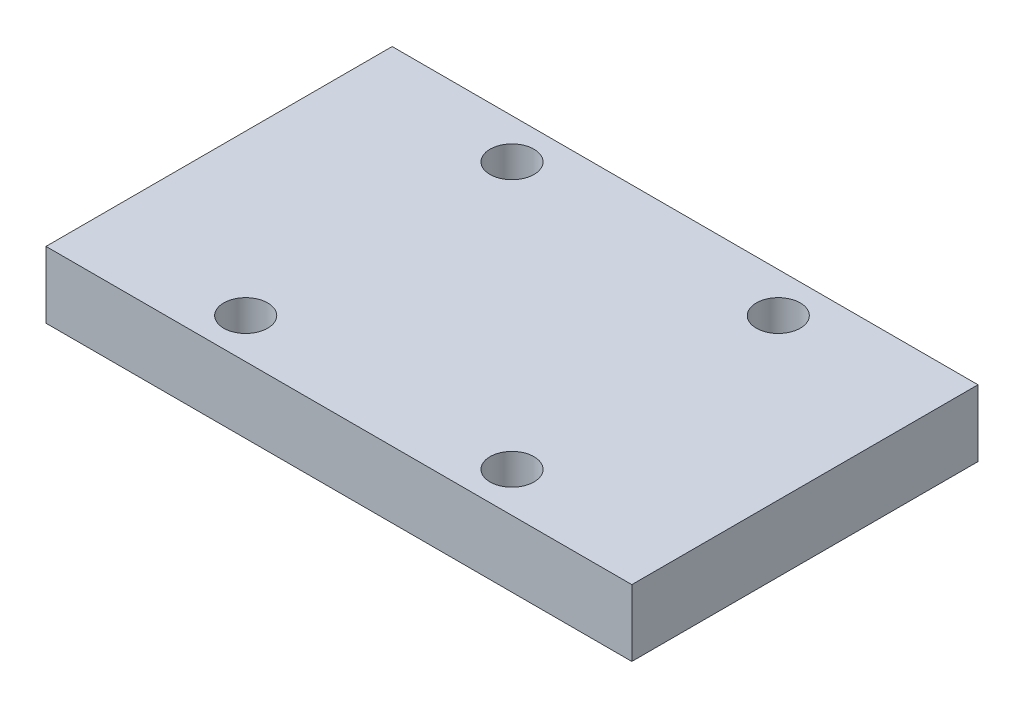
ISO-10303-21;
HEADER;
FILE_DESCRIPTION(('STEP AP214'),'2;1');
FILE_NAME('part.step','',(''),(''),'','','');
FILE_SCHEMA(('AUTOMOTIVE_DESIGN { 1 0 10303 214 1 1 1 1 }'));
ENDSEC;
DATA;
#1=APPLICATION_CONTEXT('core data for automotive mechanical design processes');
#2=APPLICATION_PROTOCOL_DEFINITION('international standard','automotive_design',2000,#1);
#3=PRODUCT_CONTEXT('',#1,'mechanical');
#4=PRODUCT('Part','Part','',(#3));
#5=PRODUCT_RELATED_PRODUCT_CATEGORY('part','',(#4));
#6=PRODUCT_DEFINITION_FORMATION('','',#4);
#7=PRODUCT_DEFINITION_CONTEXT('part definition',#1,'design');
#8=PRODUCT_DEFINITION('design','',#6,#7);
#9=PRODUCT_DEFINITION_SHAPE('','',#8);
#10=(LENGTH_UNIT() NAMED_UNIT(*) SI_UNIT(.MILLI.,.METRE.));
#11=(NAMED_UNIT(*) PLANE_ANGLE_UNIT() SI_UNIT($,.RADIAN.));
#12=(NAMED_UNIT(*) SI_UNIT($,.STERADIAN.) SOLID_ANGLE_UNIT());
#13=UNCERTAINTY_MEASURE_WITH_UNIT(LENGTH_MEASURE(1.E-05),#10,'distance_accuracy_value','');
#14=(GEOMETRIC_REPRESENTATION_CONTEXT(3) GLOBAL_UNCERTAINTY_ASSIGNED_CONTEXT((#13)) GLOBAL_UNIT_ASSIGNED_CONTEXT((#10,
#11,#12)) REPRESENTATION_CONTEXT('',''));
#15=CARTESIAN_POINT('',(0.,0.,0.));
#16=DIRECTION('',(0.,0.,1.));
#17=DIRECTION('',(1.,0.,0.));
#18=AXIS2_PLACEMENT_3D('',#15,#16,#17);
#19=CARTESIAN_POINT('',(-22.,-5.,0.));
#20=DIRECTION('',(-1.,0.,0.));
#21=DIRECTION('',(0.,0.,1.));
#22=AXIS2_PLACEMENT_3D('',#19,#20,#21);
#23=PLANE('',#22);
#24=DIRECTION('',(0.,0.,1.));
#25=VECTOR('',#24,1.);
#26=CARTESIAN_POINT('',(-22.,0.,0.));
#27=LINE('',#26,#25);
#28=CARTESIAN_POINT('',(-22.,0.,-13.));
#29=VERTEX_POINT('',#28);
#30=CARTESIAN_POINT('',(-22.,0.,13.));
#31=VERTEX_POINT('',#30);
#32=EDGE_CURVE('E116',#29,#31,#27,.T.);
#33=ORIENTED_EDGE('',*,*,#32,.F.);
#34=DIRECTION('',(0.,1.,0.));
#35=VECTOR('',#34,1.);
#36=CARTESIAN_POINT('',(-22.,-5.,-13.));
#37=LINE('',#36,#35);
#38=CARTESIAN_POINT('',(-22.,-5.,-13.));
#39=VERTEX_POINT('',#38);
#40=EDGE_CURVE('E11',#39,#29,#37,.T.);
#41=ORIENTED_EDGE('',*,*,#40,.F.);
#42=DIRECTION('',(0.,0.,1.));
#43=VECTOR('',#42,1.);
#44=CARTESIAN_POINT('',(-22.,-5.,0.));
#45=LINE('',#44,#43);
#46=CARTESIAN_POINT('',(-22.,-5.,13.));
#47=VERTEX_POINT('',#46);
#48=EDGE_CURVE('E98',#39,#47,#45,.T.);
#49=ORIENTED_EDGE('',*,*,#48,.T.);
#50=DIRECTION('',(0.,1.,0.));
#51=VECTOR('',#50,1.);
#52=CARTESIAN_POINT('',(-22.,-5.,13.));
#53=LINE('',#52,#51);
#54=EDGE_CURVE('E40',#47,#31,#53,.T.);
#55=ORIENTED_EDGE('',*,*,#54,.T.);
#56=EDGE_LOOP('',(#33,#41,#49,#55));
#57=FACE_BOUND('',#56,.T.);
#58=ADVANCED_FACE('F37',(#57),#23,.T.);
#59=CARTESIAN_POINT('',(0.,-5.,-13.));
#60=DIRECTION('',(0.,0.,1.));
#61=DIRECTION('',(1.,0.,0.));
#62=AXIS2_PLACEMENT_3D('',#59,#60,#61);
#63=PLANE('',#62);
#64=DIRECTION('',(1.,0.,0.));
#65=VECTOR('',#64,1.);
#66=CARTESIAN_POINT('',(0.,0.,-13.));
#67=LINE('',#66,#65);
#68=CARTESIAN_POINT('',(22.,0.,-13.));
#69=VERTEX_POINT('',#68);
#70=EDGE_CURVE('E70',#29,#69,#67,.T.);
#71=ORIENTED_EDGE('',*,*,#70,.T.);
#72=DIRECTION('',(0.,1.,0.));
#73=VECTOR('',#72,1.);
#74=CARTESIAN_POINT('',(22.,-5.,-13.));
#75=LINE('',#74,#73);
#76=CARTESIAN_POINT('',(22.,-5.,-13.));
#77=VERTEX_POINT('',#76);
#78=EDGE_CURVE('E46',#77,#69,#75,.T.);
#79=ORIENTED_EDGE('',*,*,#78,.F.);
#80=DIRECTION('',(1.,0.,0.));
#81=VECTOR('',#80,1.);
#82=CARTESIAN_POINT('',(0.,-5.,-13.));
#83=LINE('',#82,#81);
#84=EDGE_CURVE('E88',#39,#77,#83,.T.);
#85=ORIENTED_EDGE('',*,*,#84,.F.);
#86=ORIENTED_EDGE('',*,*,#40,.T.);
#87=EDGE_LOOP('',(#71,#79,#85,#86));
#88=FACE_BOUND('',#87,.T.);
#89=ADVANCED_FACE('F138',(#88),#63,.F.);
#90=CARTESIAN_POINT('',(22.,-5.,0.));
#91=DIRECTION('',(-1.,0.,0.));
#92=DIRECTION('',(0.,0.,1.));
#93=AXIS2_PLACEMENT_3D('',#90,#91,#92);
#94=PLANE('',#93);
#95=DIRECTION('',(0.,0.,1.));
#96=VECTOR('',#95,1.);
#97=CARTESIAN_POINT('',(22.,0.,0.));
#98=LINE('',#97,#96);
#99=CARTESIAN_POINT('',(22.,0.,13.));
#100=VERTEX_POINT('',#99);
#101=EDGE_CURVE('E95',#69,#100,#98,.T.);
#102=ORIENTED_EDGE('',*,*,#101,.T.);
#103=DIRECTION('',(0.,1.,0.));
#104=VECTOR('',#103,1.);
#105=CARTESIAN_POINT('',(22.,-5.,13.));
#106=LINE('',#105,#104);
#107=CARTESIAN_POINT('',(22.,-5.,13.));
#108=VERTEX_POINT('',#107);
#109=EDGE_CURVE('E92',#108,#100,#106,.T.);
#110=ORIENTED_EDGE('',*,*,#109,.F.);
#111=DIRECTION('',(0.,0.,1.));
#112=VECTOR('',#111,1.);
#113=CARTESIAN_POINT('',(22.,-5.,0.));
#114=LINE('',#113,#112);
#115=EDGE_CURVE('E82',#77,#108,#114,.T.);
#116=ORIENTED_EDGE('',*,*,#115,.F.);
#117=ORIENTED_EDGE('',*,*,#78,.T.);
#118=EDGE_LOOP('',(#102,#110,#116,#117));
#119=FACE_BOUND('',#118,.T.);
#120=ADVANCED_FACE('F93',(#119),#94,.F.);
#121=CARTESIAN_POINT('',(10.,-5.,10.));
#122=DIRECTION('',(0.,1.,0.));
#123=DIRECTION('',(0.,0.,1.));
#124=AXIS2_PLACEMENT_3D('',#121,#122,#123);
#125=CYLINDRICAL_SURFACE('',#124,1.65);
#126=CARTESIAN_POINT('',(10.,-5.,10.));
#127=DIRECTION('',(0.,1.,0.));
#128=DIRECTION('',(0.,0.,1.));
#129=AXIS2_PLACEMENT_3D('',#126,#127,#128);
#130=CIRCLE('',#129,1.65);
#131=CARTESIAN_POINT('',(10.,-5.,11.65));
#132=VERTEX_POINT('',#131);
#133=EDGE_CURVE('E110',#132,#132,#130,.T.);
#134=ORIENTED_EDGE('',*,*,#133,.F.);
#135=EDGE_LOOP('',(#134));
#136=FACE_BOUND('',#135,.T.);
#137=CARTESIAN_POINT('',(10.,0.,10.));
#138=DIRECTION('',(0.,1.,0.));
#139=DIRECTION('',(0.,0.,1.));
#140=AXIS2_PLACEMENT_3D('',#137,#138,#139);
#141=CIRCLE('',#140,1.65);
#142=CARTESIAN_POINT('',(10.,0.,11.65));
#143=VERTEX_POINT('',#142);
#144=EDGE_CURVE('E129',#143,#143,#141,.T.);
#145=ORIENTED_EDGE('',*,*,#144,.T.);
#146=EDGE_LOOP('',(#145));
#147=FACE_BOUND('',#146,.T.);
#148=ADVANCED_FACE('F146',(#136,#147),#125,.F.);
#149=CARTESIAN_POINT('',(10.,-5.,-10.));
#150=DIRECTION('',(0.,1.,0.));
#151=DIRECTION('',(0.,0.,1.));
#152=AXIS2_PLACEMENT_3D('',#149,#150,#151);
#153=CYLINDRICAL_SURFACE('',#152,1.65);
#154=CARTESIAN_POINT('',(10.,-5.,-10.));
#155=DIRECTION('',(0.,1.,0.));
#156=DIRECTION('',(0.,0.,1.));
#157=AXIS2_PLACEMENT_3D('',#154,#155,#156);
#158=CIRCLE('',#157,1.65);
#159=CARTESIAN_POINT('',(10.,-5.,-8.35));
#160=VERTEX_POINT('',#159);
#161=EDGE_CURVE('E107',#160,#160,#158,.F.);
#162=ORIENTED_EDGE('',*,*,#161,.T.);
#163=EDGE_LOOP('',(#162));
#164=FACE_BOUND('',#163,.T.);
#165=CARTESIAN_POINT('',(10.,0.,-10.));
#166=DIRECTION('',(0.,1.,0.));
#167=DIRECTION('',(0.,0.,1.));
#168=AXIS2_PLACEMENT_3D('',#165,#166,#167);
#169=CIRCLE('',#168,1.65);
#170=CARTESIAN_POINT('',(10.,0.,-8.35));
#171=VERTEX_POINT('',#170);
#172=EDGE_CURVE('E126',#171,#171,#169,.F.);
#173=ORIENTED_EDGE('',*,*,#172,.F.);
#174=EDGE_LOOP('',(#173));
#175=FACE_BOUND('',#174,.T.);
#176=ADVANCED_FACE('F159',(#164,#175),#153,.F.);
#177=CARTESIAN_POINT('',(-10.,-5.,-9.99999999999999));
#178=DIRECTION('',(0.,1.,0.));
#179=DIRECTION('',(0.,0.,1.));
#180=AXIS2_PLACEMENT_3D('',#177,#178,#179);
#181=CYLINDRICAL_SURFACE('',#180,1.65);
#182=CARTESIAN_POINT('',(-10.,-5.,-9.99999999999999));
#183=DIRECTION('',(0.,1.,0.));
#184=DIRECTION('',(0.,0.,1.));
#185=AXIS2_PLACEMENT_3D('',#182,#183,#184);
#186=CIRCLE('',#185,1.65);
#187=CARTESIAN_POINT('',(-10.,-5.,-8.34999999999999));
#188=VERTEX_POINT('',#187);
#189=EDGE_CURVE('E104',#188,#188,#186,.T.);
#190=ORIENTED_EDGE('',*,*,#189,.F.);
#191=EDGE_LOOP('',(#190));
#192=FACE_BOUND('',#191,.T.);
#193=CARTESIAN_POINT('',(-10.,0.,-9.99999999999999));
#194=DIRECTION('',(0.,1.,0.));
#195=DIRECTION('',(0.,0.,1.));
#196=AXIS2_PLACEMENT_3D('',#193,#194,#195);
#197=CIRCLE('',#196,1.65);
#198=CARTESIAN_POINT('',(-10.,0.,-8.34999999999999));
#199=VERTEX_POINT('',#198);
#200=EDGE_CURVE('E123',#199,#199,#197,.T.);
#201=ORIENTED_EDGE('',*,*,#200,.T.);
#202=EDGE_LOOP('',(#201));
#203=FACE_BOUND('',#202,.T.);
#204=ADVANCED_FACE('F149',(#192,#203),#181,.F.);
#205=CARTESIAN_POINT('',(0.,-5.,13.));
#206=DIRECTION('',(0.,0.,1.));
#207=DIRECTION('',(1.,0.,0.));
#208=AXIS2_PLACEMENT_3D('',#205,#206,#207);
#209=PLANE('',#208);
#210=DIRECTION('',(1.,0.,0.));
#211=VECTOR('',#210,1.);
#212=CARTESIAN_POINT('',(0.,0.,13.));
#213=LINE('',#212,#211);
#214=EDGE_CURVE('E119',#31,#100,#213,.T.);
#215=ORIENTED_EDGE('',*,*,#214,.F.);
#216=ORIENTED_EDGE('',*,*,#54,.F.);
#217=DIRECTION('',(1.,0.,0.));
#218=VECTOR('',#217,1.);
#219=CARTESIAN_POINT('',(0.,-5.,13.));
#220=LINE('',#219,#218);
#221=EDGE_CURVE('E87',#47,#108,#220,.T.);
#222=ORIENTED_EDGE('',*,*,#221,.T.);
#223=ORIENTED_EDGE('',*,*,#109,.T.);
#224=EDGE_LOOP('',(#215,#216,#222,#223));
#225=FACE_BOUND('',#224,.T.);
#226=ADVANCED_FACE('F97',(#225),#209,.T.);
#227=CARTESIAN_POINT('',(-9.99999999999999,-5.,10.));
#228=DIRECTION('',(0.,1.,0.));
#229=DIRECTION('',(0.,0.,1.));
#230=AXIS2_PLACEMENT_3D('',#227,#228,#229);
#231=CYLINDRICAL_SURFACE('',#230,1.65);
#232=CARTESIAN_POINT('',(-9.99999999999999,-5.,10.));
#233=DIRECTION('',(0.,1.,0.));
#234=DIRECTION('',(0.,0.,1.));
#235=AXIS2_PLACEMENT_3D('',#232,#233,#234);
#236=CIRCLE('',#235,1.65);
#237=CARTESIAN_POINT('',(-9.99999999999999,-5.,11.65));
#238=VERTEX_POINT('',#237);
#239=EDGE_CURVE('E113',#238,#238,#236,.F.);
#240=ORIENTED_EDGE('',*,*,#239,.T.);
#241=EDGE_LOOP('',(#240));
#242=FACE_BOUND('',#241,.T.);
#243=CARTESIAN_POINT('',(-9.99999999999999,0.,10.));
#244=DIRECTION('',(0.,1.,0.));
#245=DIRECTION('',(0.,0.,1.));
#246=AXIS2_PLACEMENT_3D('',#243,#244,#245);
#247=CIRCLE('',#246,1.65);
#248=CARTESIAN_POINT('',(-9.99999999999999,0.,11.65));
#249=VERTEX_POINT('',#248);
#250=EDGE_CURVE('E100',#249,#249,#247,.F.);
#251=ORIENTED_EDGE('',*,*,#250,.F.);
#252=EDGE_LOOP('',(#251));
#253=FACE_BOUND('',#252,.T.);
#254=ADVANCED_FACE('F152',(#242,#253),#231,.F.);
#255=CARTESIAN_POINT('',(0.,-5.,0.));
#256=DIRECTION('',(0.,1.,0.));
#257=DIRECTION('',(0.,0.,1.));
#258=AXIS2_PLACEMENT_3D('',#255,#256,#257);
#259=PLANE('',#258);
#260=ORIENTED_EDGE('',*,*,#48,.F.);
#261=ORIENTED_EDGE('',*,*,#84,.T.);
#262=ORIENTED_EDGE('',*,*,#115,.T.);
#263=ORIENTED_EDGE('',*,*,#221,.F.);
#264=EDGE_LOOP('',(#260,#261,#262,#263));
#265=FACE_BOUND('',#264,.T.);
#266=ORIENTED_EDGE('',*,*,#189,.T.);
#267=EDGE_LOOP('',(#266));
#268=FACE_BOUND('',#267,.T.);
#269=ORIENTED_EDGE('',*,*,#161,.F.);
#270=EDGE_LOOP('',(#269));
#271=FACE_BOUND('',#270,.T.);
#272=ORIENTED_EDGE('',*,*,#133,.T.);
#273=EDGE_LOOP('',(#272));
#274=FACE_BOUND('',#273,.T.);
#275=ORIENTED_EDGE('',*,*,#239,.F.);
#276=EDGE_LOOP('',(#275));
#277=FACE_BOUND('',#276,.T.);
#278=ADVANCED_FACE('F85',(#265,#268,#271,#274,#277),#259,.F.);
#279=CARTESIAN_POINT('',(0.,0.,0.));
#280=DIRECTION('',(0.,1.,0.));
#281=DIRECTION('',(0.,0.,1.));
#282=AXIS2_PLACEMENT_3D('',#279,#280,#281);
#283=PLANE('',#282);
#284=ORIENTED_EDGE('',*,*,#32,.T.);
#285=ORIENTED_EDGE('',*,*,#214,.T.);
#286=ORIENTED_EDGE('',*,*,#101,.F.);
#287=ORIENTED_EDGE('',*,*,#70,.F.);
#288=EDGE_LOOP('',(#284,#285,#286,#287));
#289=FACE_BOUND('',#288,.T.);
#290=ORIENTED_EDGE('',*,*,#200,.F.);
#291=EDGE_LOOP('',(#290));
#292=FACE_BOUND('',#291,.T.);
#293=ORIENTED_EDGE('',*,*,#172,.T.);
#294=EDGE_LOOP('',(#293));
#295=FACE_BOUND('',#294,.T.);
#296=ORIENTED_EDGE('',*,*,#144,.F.);
#297=EDGE_LOOP('',(#296));
#298=FACE_BOUND('',#297,.T.);
#299=ORIENTED_EDGE('',*,*,#250,.T.);
#300=EDGE_LOOP('',(#299));
#301=FACE_BOUND('',#300,.T.);
#302=ADVANCED_FACE('F135',(#289,#292,#295,#298,#301),#283,.T.);
#303=CLOSED_SHELL('',(#58,#89,#120,#148,#176,#204,#226,#254,#278,#302));
#304=MANIFOLD_SOLID_BREP('B2',#303);
#305=ADVANCED_BREP_SHAPE_REPRESENTATION('',(#18,#304),#14);
#306=SHAPE_DEFINITION_REPRESENTATION(#9,#305);
ENDSEC;
END-ISO-10303-21;
